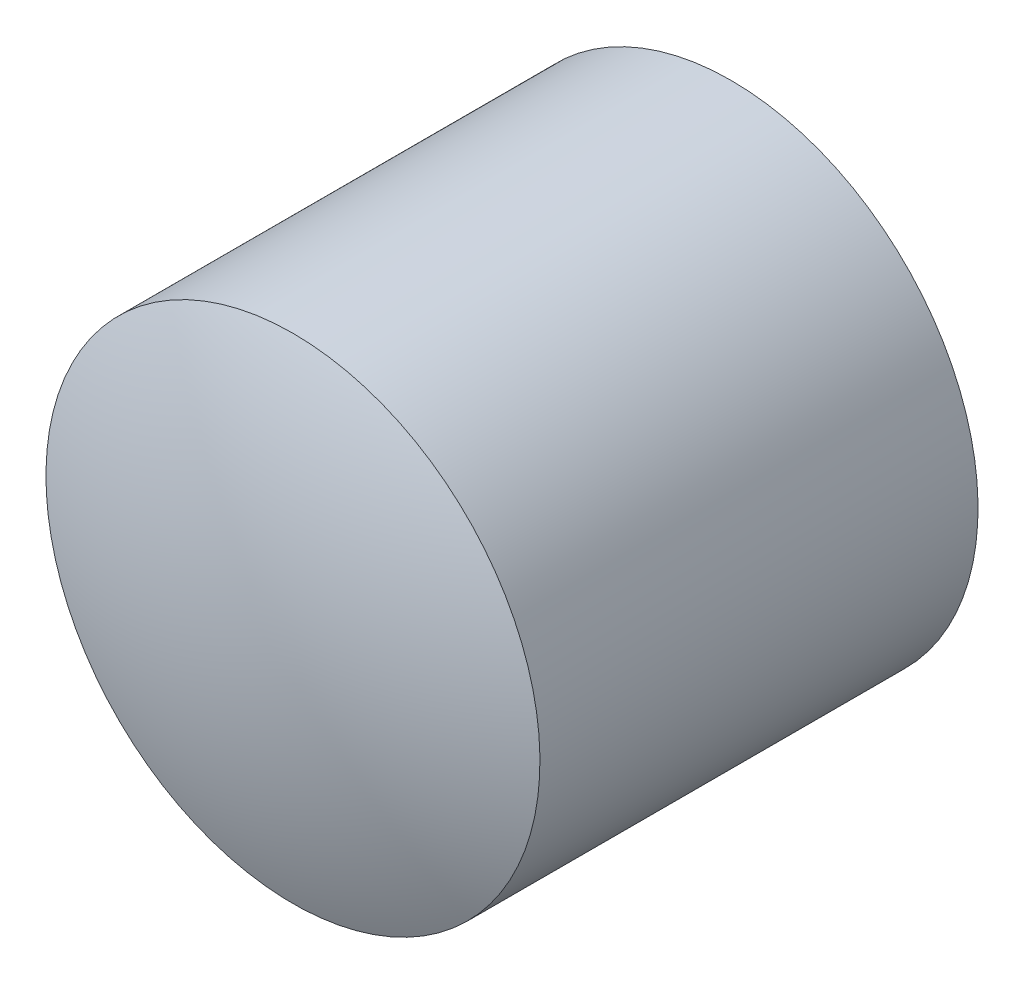
ISO-10303-21;
HEADER;
FILE_DESCRIPTION(('STEP AP214'),'2;1');
FILE_NAME('part.step','',(''),(''),'','','');
FILE_SCHEMA(('AUTOMOTIVE_DESIGN { 1 0 10303 214 1 1 1 1 }'));
ENDSEC;
DATA;
#1=APPLICATION_CONTEXT('core data for automotive mechanical design processes');
#2=APPLICATION_PROTOCOL_DEFINITION('international standard','automotive_design',2000,#1);
#3=PRODUCT_CONTEXT('',#1,'mechanical');
#4=PRODUCT('Part','Part','',(#3));
#5=PRODUCT_RELATED_PRODUCT_CATEGORY('part','',(#4));
#6=PRODUCT_DEFINITION_FORMATION('','',#4);
#7=PRODUCT_DEFINITION_CONTEXT('part definition',#1,'design');
#8=PRODUCT_DEFINITION('design','',#6,#7);
#9=PRODUCT_DEFINITION_SHAPE('','',#8);
#10=(LENGTH_UNIT() NAMED_UNIT(*) SI_UNIT(.MILLI.,.METRE.));
#11=(NAMED_UNIT(*) PLANE_ANGLE_UNIT() SI_UNIT($,.RADIAN.));
#12=(NAMED_UNIT(*) SI_UNIT($,.STERADIAN.) SOLID_ANGLE_UNIT());
#13=UNCERTAINTY_MEASURE_WITH_UNIT(LENGTH_MEASURE(1.E-05),#10,'distance_accuracy_value','');
#14=(GEOMETRIC_REPRESENTATION_CONTEXT(3) GLOBAL_UNCERTAINTY_ASSIGNED_CONTEXT((#13)) GLOBAL_UNIT_ASSIGNED_CONTEXT((#10,
#11,#12)) REPRESENTATION_CONTEXT('',''));
#15=CARTESIAN_POINT('',(0.,0.,0.));
#16=DIRECTION('',(0.,0.,1.));
#17=DIRECTION('',(1.,0.,0.));
#18=AXIS2_PLACEMENT_3D('',#15,#16,#17);
#19=CARTESIAN_POINT('',(0.,0.,-3.12714776632302));
#20=DIRECTION('',(0.,0.,-1.));
#21=DIRECTION('',(0.,1.,0.));
#22=AXIS2_PLACEMENT_3D('',#19,#20,#21);
#23=SPHERICAL_SURFACE('',#22,10.);
#24=CARTESIAN_POINT('',(0.,0.,6.09154926742312));
#25=DIRECTION('',(0.,0.,-1.));
#26=DIRECTION('',(0.,1.,0.));
#27=AXIS2_PLACEMENT_3D('',#24,#25,#26);
#28=CIRCLE('',#27,3.875);
#29=CARTESIAN_POINT('',(0.,3.875,6.09154926742312));
#30=VERTEX_POINT('',#29);
#31=EDGE_CURVE('E50',#30,#30,#28,.T.);
#32=ORIENTED_EDGE('',*,*,#31,.F.);
#33=EDGE_LOOP('',(#32));
#34=FACE_BOUND('',#33,.T.);
#35=ADVANCED_FACE('F43',(#34),#23,.T.);
#36=CARTESIAN_POINT('',(0.,0.,-10.));
#37=DIRECTION('',(0.,0.,-1.));
#38=DIRECTION('',(0.,1.,0.));
#39=AXIS2_PLACEMENT_3D('',#36,#37,#38);
#40=SPHERICAL_SURFACE('',#39,10.);
#41=CARTESIAN_POINT('',(0.,0.,-0.781302966253855));
#42=DIRECTION('',(0.,0.,-1.));
#43=DIRECTION('',(0.,1.,0.));
#44=AXIS2_PLACEMENT_3D('',#41,#42,#43);
#45=CIRCLE('',#44,3.875);
#46=CARTESIAN_POINT('',(0.,3.875,-0.781302966253854));
#47=VERTEX_POINT('',#46);
#48=EDGE_CURVE('E10',#47,#47,#45,.T.);
#49=ORIENTED_EDGE('',*,*,#48,.T.);
#50=EDGE_LOOP('',(#49));
#51=FACE_BOUND('',#50,.T.);
#52=ADVANCED_FACE('F61',(#51),#40,.F.);
#53=CARTESIAN_POINT('',(0.,0.,0.));
#54=DIRECTION('',(0.,0.,-1.));
#55=DIRECTION('',(0.,1.,0.));
#56=AXIS2_PLACEMENT_3D('',#53,#54,#55);
#57=CYLINDRICAL_SURFACE('',#56,3.875);
#58=ORIENTED_EDGE('',*,*,#31,.T.);
#59=EDGE_LOOP('',(#58));
#60=FACE_BOUND('',#59,.T.);
#61=ORIENTED_EDGE('',*,*,#48,.F.);
#62=EDGE_LOOP('',(#61));
#63=FACE_BOUND('',#62,.T.);
#64=ADVANCED_FACE('F57',(#60,#63),#57,.T.);
#65=CLOSED_SHELL('',(#35,#52,#64));
#66=MANIFOLD_SOLID_BREP('B2',#65);
#67=ADVANCED_BREP_SHAPE_REPRESENTATION('',(#18,#66),#14);
#68=SHAPE_DEFINITION_REPRESENTATION(#9,#67);
ENDSEC;
END-ISO-10303-21;
